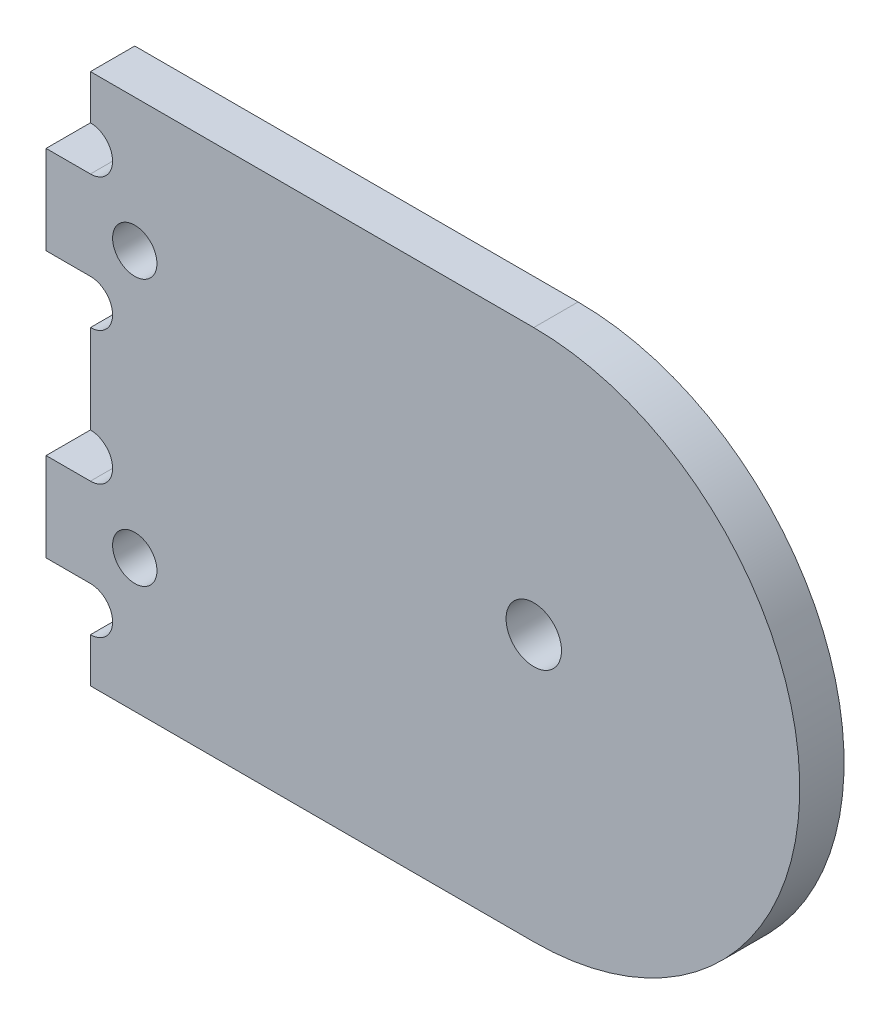
ISO-10303-21;
HEADER;
FILE_DESCRIPTION(('STEP AP214'),'2;1');
FILE_NAME('part.step','',(''),(''),'','','');
FILE_SCHEMA(('AUTOMOTIVE_DESIGN { 1 0 10303 214 1 1 1 1 }'));
ENDSEC;
DATA;
#1=APPLICATION_CONTEXT('core data for automotive mechanical design processes');
#2=APPLICATION_PROTOCOL_DEFINITION('international standard','automotive_design',2000,#1);
#3=PRODUCT_CONTEXT('',#1,'mechanical');
#4=PRODUCT('Part','Part','',(#3));
#5=PRODUCT_RELATED_PRODUCT_CATEGORY('part','',(#4));
#6=PRODUCT_DEFINITION_FORMATION('','',#4);
#7=PRODUCT_DEFINITION_CONTEXT('part definition',#1,'design');
#8=PRODUCT_DEFINITION('design','',#6,#7);
#9=PRODUCT_DEFINITION_SHAPE('','',#8);
#10=(LENGTH_UNIT() NAMED_UNIT(*) SI_UNIT(.MILLI.,.METRE.));
#11=(NAMED_UNIT(*) PLANE_ANGLE_UNIT() SI_UNIT($,.RADIAN.));
#12=(NAMED_UNIT(*) SI_UNIT($,.STERADIAN.) SOLID_ANGLE_UNIT());
#13=UNCERTAINTY_MEASURE_WITH_UNIT(LENGTH_MEASURE(1.E-05),#10,'distance_accuracy_value','');
#14=(GEOMETRIC_REPRESENTATION_CONTEXT(3) GLOBAL_UNCERTAINTY_ASSIGNED_CONTEXT((#13)) GLOBAL_UNIT_ASSIGNED_CONTEXT((#10,
#11,#12)) REPRESENTATION_CONTEXT('',''));
#15=CARTESIAN_POINT('',(0.,0.,0.));
#16=DIRECTION('',(0.,0.,1.));
#17=DIRECTION('',(1.,0.,0.));
#18=AXIS2_PLACEMENT_3D('',#15,#16,#17);
#19=CARTESIAN_POINT('',(-36.0930614932367,10.8790255418588,2.));
#20=DIRECTION('',(0.,0.,1.));
#21=DIRECTION('',(1.,0.,0.));
#22=AXIS2_PLACEMENT_3D('',#19,#20,#21);
#23=PLANE('',#22);
#24=CARTESIAN_POINT('',(-34.0930614932367,7.87902554185879,2.));
#25=DIRECTION('',(0.,0.,1.));
#26=DIRECTION('',(1.,0.,0.));
#27=AXIS2_PLACEMENT_3D('',#24,#25,#26);
#28=CIRCLE('',#27,0.999999999999998);
#29=CARTESIAN_POINT('',(-33.0930614932367,7.87902554185879,2.));
#30=VERTEX_POINT('',#29);
#31=EDGE_CURVE('E338',#30,#30,#28,.T.);
#32=ORIENTED_EDGE('',*,*,#31,.F.);
#33=EDGE_LOOP('',(#32));
#34=FACE_BOUND('',#33,.T.);
#35=DIRECTION('',(0.,-1.,0.));
#36=VECTOR('',#35,1.);
#37=CARTESIAN_POINT('',(-36.0930614932367,13.8790255418588,2.));
#38=LINE('',#37,#36);
#39=CARTESIAN_POINT('',(-36.0930614932367,13.8790255418588,2.));
#40=VERTEX_POINT('',#39);
#41=CARTESIAN_POINT('',(-36.0930614932367,11.8790255418588,2.));
#42=VERTEX_POINT('',#41);
#43=EDGE_CURVE('E209',#40,#42,#38,.T.);
#44=ORIENTED_EDGE('',*,*,#43,.T.);
#45=CARTESIAN_POINT('',(-36.0930614932367,10.8790255418588,2.));
#46=DIRECTION('',(0.,0.,-1.));
#47=DIRECTION('',(1.,0.,0.));
#48=AXIS2_PLACEMENT_3D('',#45,#46,#47);
#49=CIRCLE('',#48,1.);
#50=CARTESIAN_POINT('',(-36.0930614932367,9.87902554185878,2.));
#51=VERTEX_POINT('',#50);
#52=EDGE_CURVE('E117',#42,#51,#49,.T.);
#53=ORIENTED_EDGE('',*,*,#52,.T.);
#54=DIRECTION('',(-1.,0.,0.));
#55=VECTOR('',#54,1.);
#56=CARTESIAN_POINT('',(-36.0930614932367,9.87902554185878,2.));
#57=LINE('',#56,#55);
#58=CARTESIAN_POINT('',(-38.0930614932367,9.87902554185878,2.));
#59=VERTEX_POINT('',#58);
#60=EDGE_CURVE('E248',#51,#59,#57,.T.);
#61=ORIENTED_EDGE('',*,*,#60,.T.);
#62=DIRECTION('',(0.,-1.,0.));
#63=VECTOR('',#62,1.);
#64=CARTESIAN_POINT('',(-38.0930614932367,9.87902554185878,2.));
#65=LINE('',#64,#63);
#66=CARTESIAN_POINT('',(-38.0930614932367,5.87902554185878,2.));
#67=VERTEX_POINT('',#66);
#68=EDGE_CURVE('E267',#59,#67,#65,.T.);
#69=ORIENTED_EDGE('',*,*,#68,.T.);
#70=DIRECTION('',(1.,0.,0.));
#71=VECTOR('',#70,1.);
#72=CARTESIAN_POINT('',(-36.0930614932367,5.87902554185878,2.));
#73=LINE('',#72,#71);
#74=CARTESIAN_POINT('',(-36.0930614932367,5.87902554185878,2.));
#75=VERTEX_POINT('',#74);
#76=EDGE_CURVE('E264',#67,#75,#73,.T.);
#77=ORIENTED_EDGE('',*,*,#76,.T.);
#78=CARTESIAN_POINT('',(-36.0930614932367,4.87902554185878,2.));
#79=DIRECTION('',(0.,0.,-1.));
#80=DIRECTION('',(-1.,0.,0.));
#81=AXIS2_PLACEMENT_3D('',#78,#79,#80);
#82=CIRCLE('',#81,1.);
#83=CARTESIAN_POINT('',(-36.0930614932367,3.87902554185878,2.));
#84=VERTEX_POINT('',#83);
#85=EDGE_CURVE('E266',#75,#84,#82,.T.);
#86=ORIENTED_EDGE('',*,*,#85,.T.);
#87=DIRECTION('',(0.,-1.,0.));
#88=VECTOR('',#87,1.);
#89=CARTESIAN_POINT('',(-36.0930614932367,3.87902554185878,2.));
#90=LINE('',#89,#88);
#91=CARTESIAN_POINT('',(-36.0930614932367,-0.120974458141217,2.));
#92=VERTEX_POINT('',#91);
#93=EDGE_CURVE('E269',#84,#92,#90,.T.);
#94=ORIENTED_EDGE('',*,*,#93,.T.);
#95=CARTESIAN_POINT('',(-36.0930614932367,-1.12097445814122,2.));
#96=DIRECTION('',(0.,0.,-1.));
#97=DIRECTION('',(1.,0.,0.));
#98=AXIS2_PLACEMENT_3D('',#95,#96,#97);
#99=CIRCLE('',#98,1.);
#100=CARTESIAN_POINT('',(-36.0930614932367,-2.12097445814122,2.));
#101=VERTEX_POINT('',#100);
#102=EDGE_CURVE('E275',#92,#101,#99,.T.);
#103=ORIENTED_EDGE('',*,*,#102,.T.);
#104=DIRECTION('',(-1.,0.,0.));
#105=VECTOR('',#104,1.);
#106=CARTESIAN_POINT('',(-36.0930614932367,-2.12097445814122,2.));
#107=LINE('',#106,#105);
#108=CARTESIAN_POINT('',(-38.0930614932367,-2.12097445814122,2.));
#109=VERTEX_POINT('',#108);
#110=EDGE_CURVE('E277',#101,#109,#107,.T.);
#111=ORIENTED_EDGE('',*,*,#110,.T.);
#112=DIRECTION('',(0.,-1.,0.));
#113=VECTOR('',#112,1.);
#114=CARTESIAN_POINT('',(-38.0930614932367,-2.12097445814122,2.));
#115=LINE('',#114,#113);
#116=CARTESIAN_POINT('',(-38.0930614932367,-6.12097445814122,2.));
#117=VERTEX_POINT('',#116);
#118=EDGE_CURVE('E279',#109,#117,#115,.T.);
#119=ORIENTED_EDGE('',*,*,#118,.T.);
#120=DIRECTION('',(1.,0.,0.));
#121=VECTOR('',#120,1.);
#122=CARTESIAN_POINT('',(-36.0930614932367,-6.12097445814122,2.));
#123=LINE('',#122,#121);
#124=CARTESIAN_POINT('',(-36.0930614932367,-6.12097445814122,2.));
#125=VERTEX_POINT('',#124);
#126=EDGE_CURVE('E281',#117,#125,#123,.T.);
#127=ORIENTED_EDGE('',*,*,#126,.T.);
#128=CARTESIAN_POINT('',(-36.0930614932367,-7.12097445814122,2.));
#129=DIRECTION('',(0.,0.,-1.));
#130=DIRECTION('',(-1.,0.,0.));
#131=AXIS2_PLACEMENT_3D('',#128,#129,#130);
#132=CIRCLE('',#131,1.);
#133=CARTESIAN_POINT('',(-36.0930614932367,-8.12097445814122,2.));
#134=VERTEX_POINT('',#133);
#135=EDGE_CURVE('E283',#125,#134,#132,.T.);
#136=ORIENTED_EDGE('',*,*,#135,.T.);
#137=DIRECTION('',(0.,-1.,0.));
#138=VECTOR('',#137,1.);
#139=CARTESIAN_POINT('',(-36.0930614932367,-8.12097445814122,2.));
#140=LINE('',#139,#138);
#141=CARTESIAN_POINT('',(-36.0930614932367,-10.1209744581412,2.));
#142=VERTEX_POINT('',#141);
#143=EDGE_CURVE('E160',#134,#142,#140,.T.);
#144=ORIENTED_EDGE('',*,*,#143,.T.);
#145=DIRECTION('',(1.,0.,0.));
#146=VECTOR('',#145,1.);
#147=CARTESIAN_POINT('',(-36.0930614932367,-10.1209744581412,2.));
#148=LINE('',#147,#146);
#149=CARTESIAN_POINT('',(-16.0930614932367,-10.1209744581412,2.));
#150=VERTEX_POINT('',#149);
#151=EDGE_CURVE('E154',#142,#150,#148,.T.);
#152=ORIENTED_EDGE('',*,*,#151,.T.);
#153=CARTESIAN_POINT('',(-16.0930614932367,1.87902554185879,2.));
#154=DIRECTION('',(0.,0.,1.));
#155=DIRECTION('',(1.,0.,0.));
#156=AXIS2_PLACEMENT_3D('',#153,#154,#155);
#157=CIRCLE('',#156,12.);
#158=CARTESIAN_POINT('',(-16.0930614932367,13.8790255418588,2.));
#159=VERTEX_POINT('',#158);
#160=EDGE_CURVE('E158',#150,#159,#157,.T.);
#161=ORIENTED_EDGE('',*,*,#160,.T.);
#162=DIRECTION('',(-1.,0.,0.));
#163=VECTOR('',#162,1.);
#164=CARTESIAN_POINT('',(-36.0930614932367,13.8790255418588,2.));
#165=LINE('',#164,#163);
#166=EDGE_CURVE('E50',#159,#40,#165,.T.);
#167=ORIENTED_EDGE('',*,*,#166,.T.);
#168=EDGE_LOOP('',(#44,#53,#61,#69,#77,#86,#94,#103,#111,#119,#127,#136,#144,#152,#161,#167));
#169=FACE_BOUND('',#168,.T.);
#170=CARTESIAN_POINT('',(-16.0930614932367,1.87902554185879,2.));
#171=DIRECTION('',(0.,0.,1.));
#172=DIRECTION('',(1.,0.,0.));
#173=AXIS2_PLACEMENT_3D('',#170,#171,#172);
#174=CIRCLE('',#173,1.25);
#175=CARTESIAN_POINT('',(-14.8430614932367,1.87902554185879,2.));
#176=VERTEX_POINT('',#175);
#177=EDGE_CURVE('E182',#176,#176,#174,.T.);
#178=ORIENTED_EDGE('',*,*,#177,.F.);
#179=EDGE_LOOP('',(#178));
#180=FACE_BOUND('',#179,.T.);
#181=CARTESIAN_POINT('',(-34.0930614932367,-4.12097445814122,2.));
#182=DIRECTION('',(0.,0.,1.));
#183=DIRECTION('',(1.,0.,0.));
#184=AXIS2_PLACEMENT_3D('',#181,#182,#183);
#185=CIRCLE('',#184,0.999999999999998);
#186=CARTESIAN_POINT('',(-33.0930614932367,-4.12097445814122,2.));
#187=VERTEX_POINT('',#186);
#188=EDGE_CURVE('E329',#187,#187,#185,.T.);
#189=ORIENTED_EDGE('',*,*,#188,.F.);
#190=EDGE_LOOP('',(#189));
#191=FACE_BOUND('',#190,.T.);
#192=ADVANCED_FACE('F33',(#34,#169,#180,#191),#23,.T.);
#193=CARTESIAN_POINT('',(-36.0930614932367,10.8790255418588,0.));
#194=DIRECTION('',(0.,0.,1.));
#195=DIRECTION('',(1.,0.,0.));
#196=AXIS2_PLACEMENT_3D('',#193,#194,#195);
#197=PLANE('',#196);
#198=DIRECTION('',(0.,-1.,0.));
#199=VECTOR('',#198,1.);
#200=CARTESIAN_POINT('',(-36.0930614932367,13.8790255418588,0.));
#201=LINE('',#200,#199);
#202=CARTESIAN_POINT('',(-36.0930614932367,13.8790255418588,0.));
#203=VERTEX_POINT('',#202);
#204=CARTESIAN_POINT('',(-36.0930614932367,11.8790255418588,0.));
#205=VERTEX_POINT('',#204);
#206=EDGE_CURVE('E178',#203,#205,#201,.T.);
#207=ORIENTED_EDGE('',*,*,#206,.F.);
#208=DIRECTION('',(-1.,0.,0.));
#209=VECTOR('',#208,1.);
#210=CARTESIAN_POINT('',(-36.0930614932367,13.8790255418588,0.));
#211=LINE('',#210,#209);
#212=CARTESIAN_POINT('',(-16.0930614932367,13.8790255418588,0.));
#213=VERTEX_POINT('',#212);
#214=EDGE_CURVE('E109',#213,#203,#211,.T.);
#215=ORIENTED_EDGE('',*,*,#214,.F.);
#216=CARTESIAN_POINT('',(-16.0930614932367,1.87902554185879,0.));
#217=DIRECTION('',(0.,0.,1.));
#218=DIRECTION('',(1.,0.,0.));
#219=AXIS2_PLACEMENT_3D('',#216,#217,#218);
#220=CIRCLE('',#219,12.);
#221=CARTESIAN_POINT('',(-16.0930614932367,-10.1209744581412,0.));
#222=VERTEX_POINT('',#221);
#223=EDGE_CURVE('E103',#222,#213,#220,.T.);
#224=ORIENTED_EDGE('',*,*,#223,.F.);
#225=DIRECTION('',(1.,0.,0.));
#226=VECTOR('',#225,1.);
#227=CARTESIAN_POINT('',(-36.0930614932367,-10.1209744581412,0.));
#228=LINE('',#227,#226);
#229=CARTESIAN_POINT('',(-36.0930614932367,-10.1209744581412,0.));
#230=VERTEX_POINT('',#229);
#231=EDGE_CURVE('E168',#230,#222,#228,.T.);
#232=ORIENTED_EDGE('',*,*,#231,.F.);
#233=DIRECTION('',(0.,-1.,0.));
#234=VECTOR('',#233,1.);
#235=CARTESIAN_POINT('',(-36.0930614932367,-8.12097445814122,0.));
#236=LINE('',#235,#234);
#237=CARTESIAN_POINT('',(-36.0930614932367,-8.12097445814122,0.));
#238=VERTEX_POINT('',#237);
#239=EDGE_CURVE('E204',#238,#230,#236,.T.);
#240=ORIENTED_EDGE('',*,*,#239,.F.);
#241=CARTESIAN_POINT('',(-36.0930614932367,-7.12097445814122,0.));
#242=DIRECTION('',(0.,0.,-1.));
#243=DIRECTION('',(-1.,0.,0.));
#244=AXIS2_PLACEMENT_3D('',#241,#242,#243);
#245=CIRCLE('',#244,1.);
#246=CARTESIAN_POINT('',(-36.0930614932367,-6.12097445814122,0.));
#247=VERTEX_POINT('',#246);
#248=EDGE_CURVE('E202',#247,#238,#245,.T.);
#249=ORIENTED_EDGE('',*,*,#248,.F.);
#250=DIRECTION('',(1.,0.,0.));
#251=VECTOR('',#250,1.);
#252=CARTESIAN_POINT('',(-36.0930614932367,-6.12097445814122,0.));
#253=LINE('',#252,#251);
#254=CARTESIAN_POINT('',(-38.0930614932367,-6.12097445814122,0.));
#255=VERTEX_POINT('',#254);
#256=EDGE_CURVE('E200',#255,#247,#253,.T.);
#257=ORIENTED_EDGE('',*,*,#256,.F.);
#258=DIRECTION('',(0.,-1.,0.));
#259=VECTOR('',#258,1.);
#260=CARTESIAN_POINT('',(-38.0930614932367,-2.12097445814122,0.));
#261=LINE('',#260,#259);
#262=CARTESIAN_POINT('',(-38.0930614932367,-2.12097445814122,0.));
#263=VERTEX_POINT('',#262);
#264=EDGE_CURVE('E198',#263,#255,#261,.T.);
#265=ORIENTED_EDGE('',*,*,#264,.F.);
#266=DIRECTION('',(-1.,0.,0.));
#267=VECTOR('',#266,1.);
#268=CARTESIAN_POINT('',(-36.0930614932367,-2.12097445814122,0.));
#269=LINE('',#268,#267);
#270=CARTESIAN_POINT('',(-36.0930614932367,-2.12097445814122,0.));
#271=VERTEX_POINT('',#270);
#272=EDGE_CURVE('E196',#271,#263,#269,.T.);
#273=ORIENTED_EDGE('',*,*,#272,.F.);
#274=CARTESIAN_POINT('',(-36.0930614932367,-1.12097445814122,0.));
#275=DIRECTION('',(0.,0.,-1.));
#276=DIRECTION('',(1.,0.,0.));
#277=AXIS2_PLACEMENT_3D('',#274,#275,#276);
#278=CIRCLE('',#277,1.);
#279=CARTESIAN_POINT('',(-36.0930614932367,-0.120974458141217,0.));
#280=VERTEX_POINT('',#279);
#281=EDGE_CURVE('E194',#280,#271,#278,.T.);
#282=ORIENTED_EDGE('',*,*,#281,.F.);
#283=DIRECTION('',(0.,-1.,0.));
#284=VECTOR('',#283,1.);
#285=CARTESIAN_POINT('',(-36.0930614932367,3.87902554185878,0.));
#286=LINE('',#285,#284);
#287=CARTESIAN_POINT('',(-36.0930614932367,3.87902554185878,0.));
#288=VERTEX_POINT('',#287);
#289=EDGE_CURVE('E192',#288,#280,#286,.T.);
#290=ORIENTED_EDGE('',*,*,#289,.F.);
#291=CARTESIAN_POINT('',(-36.0930614932367,4.87902554185878,0.));
#292=DIRECTION('',(0.,0.,-1.));
#293=DIRECTION('',(-1.,0.,0.));
#294=AXIS2_PLACEMENT_3D('',#291,#292,#293);
#295=CIRCLE('',#294,1.);
#296=CARTESIAN_POINT('',(-36.0930614932367,5.87902554185878,0.));
#297=VERTEX_POINT('',#296);
#298=EDGE_CURVE('E190',#297,#288,#295,.T.);
#299=ORIENTED_EDGE('',*,*,#298,.F.);
#300=DIRECTION('',(1.,0.,0.));
#301=VECTOR('',#300,1.);
#302=CARTESIAN_POINT('',(-36.0930614932367,5.87902554185878,0.));
#303=LINE('',#302,#301);
#304=CARTESIAN_POINT('',(-38.0930614932367,5.87902554185878,0.));
#305=VERTEX_POINT('',#304);
#306=EDGE_CURVE('E188',#305,#297,#303,.T.);
#307=ORIENTED_EDGE('',*,*,#306,.F.);
#308=DIRECTION('',(0.,-1.,0.));
#309=VECTOR('',#308,1.);
#310=CARTESIAN_POINT('',(-38.0930614932367,9.87902554185878,0.));
#311=LINE('',#310,#309);
#312=CARTESIAN_POINT('',(-38.0930614932367,9.87902554185878,0.));
#313=VERTEX_POINT('',#312);
#314=EDGE_CURVE('E186',#313,#305,#311,.T.);
#315=ORIENTED_EDGE('',*,*,#314,.F.);
#316=DIRECTION('',(-1.,0.,0.));
#317=VECTOR('',#316,1.);
#318=CARTESIAN_POINT('',(-36.0930614932367,9.87902554185878,0.));
#319=LINE('',#318,#317);
#320=CARTESIAN_POINT('',(-36.0930614932367,9.87902554185878,0.));
#321=VERTEX_POINT('',#320);
#322=EDGE_CURVE('E184',#321,#313,#319,.T.);
#323=ORIENTED_EDGE('',*,*,#322,.F.);
#324=CARTESIAN_POINT('',(-36.0930614932367,10.8790255418588,0.));
#325=DIRECTION('',(0.,0.,-1.));
#326=DIRECTION('',(1.,0.,0.));
#327=AXIS2_PLACEMENT_3D('',#324,#325,#326);
#328=CIRCLE('',#327,1.);
#329=EDGE_CURVE('E181',#205,#321,#328,.T.);
#330=ORIENTED_EDGE('',*,*,#329,.F.);
#331=EDGE_LOOP('',(#207,#215,#224,#232,#240,#249,#257,#265,#273,#282,#290,#299,#307,#315,#323,#330));
#332=FACE_BOUND('',#331,.T.);
#333=CARTESIAN_POINT('',(-16.0930614932367,1.87902554185879,0.));
#334=DIRECTION('',(0.,0.,1.));
#335=DIRECTION('',(1.,0.,0.));
#336=AXIS2_PLACEMENT_3D('',#333,#334,#335);
#337=CIRCLE('',#336,1.25);
#338=CARTESIAN_POINT('',(-14.8430614932367,1.87902554185879,0.));
#339=VERTEX_POINT('',#338);
#340=EDGE_CURVE('E341',#339,#339,#337,.T.);
#341=ORIENTED_EDGE('',*,*,#340,.T.);
#342=EDGE_LOOP('',(#341));
#343=FACE_BOUND('',#342,.T.);
#344=CARTESIAN_POINT('',(-34.0930614932367,7.87902554185879,0.));
#345=DIRECTION('',(0.,0.,1.));
#346=DIRECTION('',(1.,0.,0.));
#347=AXIS2_PLACEMENT_3D('',#344,#345,#346);
#348=CIRCLE('',#347,0.999999999999998);
#349=CARTESIAN_POINT('',(-33.0930614932367,7.87902554185879,0.));
#350=VERTEX_POINT('',#349);
#351=EDGE_CURVE('E335',#350,#350,#348,.T.);
#352=ORIENTED_EDGE('',*,*,#351,.T.);
#353=EDGE_LOOP('',(#352));
#354=FACE_BOUND('',#353,.T.);
#355=CARTESIAN_POINT('',(-34.0930614932367,-4.12097445814122,0.));
#356=DIRECTION('',(0.,0.,1.));
#357=DIRECTION('',(1.,0.,0.));
#358=AXIS2_PLACEMENT_3D('',#355,#356,#357);
#359=CIRCLE('',#358,0.999999999999998);
#360=CARTESIAN_POINT('',(-33.0930614932367,-4.12097445814122,0.));
#361=VERTEX_POINT('',#360);
#362=EDGE_CURVE('E332',#361,#361,#359,.T.);
#363=ORIENTED_EDGE('',*,*,#362,.T.);
#364=EDGE_LOOP('',(#363));
#365=FACE_BOUND('',#364,.T.);
#366=ADVANCED_FACE('F252',(#332,#343,#354,#365),#197,.F.);
#367=CARTESIAN_POINT('',(-36.0930614932367,13.8790255418588,2.));
#368=DIRECTION('',(1.,0.,0.));
#369=DIRECTION('',(0.,0.,-1.));
#370=AXIS2_PLACEMENT_3D('',#367,#368,#369);
#371=PLANE('',#370);
#372=ORIENTED_EDGE('',*,*,#206,.T.);
#373=DIRECTION('',(0.,0.,-1.));
#374=VECTOR('',#373,1.);
#375=CARTESIAN_POINT('',(-36.0930614932367,11.8790255418588,2.));
#376=LINE('',#375,#374);
#377=EDGE_CURVE('E11',#42,#205,#376,.T.);
#378=ORIENTED_EDGE('',*,*,#377,.F.);
#379=ORIENTED_EDGE('',*,*,#43,.F.);
#380=DIRECTION('',(0.,0.,-1.));
#381=VECTOR('',#380,1.);
#382=CARTESIAN_POINT('',(-36.0930614932367,13.8790255418588,2.));
#383=LINE('',#382,#381);
#384=EDGE_CURVE('E174',#40,#203,#383,.T.);
#385=ORIENTED_EDGE('',*,*,#384,.T.);
#386=EDGE_LOOP('',(#372,#378,#379,#385));
#387=FACE_BOUND('',#386,.T.);
#388=ADVANCED_FACE('F35',(#387),#371,.F.);
#389=CARTESIAN_POINT('',(-36.0930614932367,10.8790255418588,2.));
#390=DIRECTION('',(0.,0.,-1.));
#391=DIRECTION('',(-1.,0.,0.));
#392=AXIS2_PLACEMENT_3D('',#389,#390,#391);
#393=CYLINDRICAL_SURFACE('',#392,1.);
#394=ORIENTED_EDGE('',*,*,#329,.T.);
#395=DIRECTION('',(0.,0.,-1.));
#396=VECTOR('',#395,1.);
#397=CARTESIAN_POINT('',(-36.0930614932367,9.87902554185878,2.));
#398=LINE('',#397,#396);
#399=EDGE_CURVE('E42',#51,#321,#398,.T.);
#400=ORIENTED_EDGE('',*,*,#399,.F.);
#401=ORIENTED_EDGE('',*,*,#52,.F.);
#402=ORIENTED_EDGE('',*,*,#377,.T.);
#403=EDGE_LOOP('',(#394,#400,#401,#402));
#404=FACE_BOUND('',#403,.T.);
#405=ADVANCED_FACE('F483',(#404),#393,.F.);
#406=CARTESIAN_POINT('',(-36.0930614932367,9.87902554185878,2.));
#407=DIRECTION('',(0.,-1.,0.));
#408=DIRECTION('',(0.,0.,-1.));
#409=AXIS2_PLACEMENT_3D('',#406,#407,#408);
#410=PLANE('',#409);
#411=ORIENTED_EDGE('',*,*,#322,.T.);
#412=DIRECTION('',(0.,0.,-1.));
#413=VECTOR('',#412,1.);
#414=CARTESIAN_POINT('',(-38.0930614932367,9.87902554185878,2.));
#415=LINE('',#414,#413);
#416=EDGE_CURVE('E240',#59,#313,#415,.T.);
#417=ORIENTED_EDGE('',*,*,#416,.F.);
#418=ORIENTED_EDGE('',*,*,#60,.F.);
#419=ORIENTED_EDGE('',*,*,#399,.T.);
#420=EDGE_LOOP('',(#411,#417,#418,#419));
#421=FACE_BOUND('',#420,.T.);
#422=ADVANCED_FACE('F246',(#421),#410,.F.);
#423=CARTESIAN_POINT('',(-38.0930614932367,9.87902554185878,2.));
#424=DIRECTION('',(1.,0.,0.));
#425=DIRECTION('',(0.,0.,-1.));
#426=AXIS2_PLACEMENT_3D('',#423,#424,#425);
#427=PLANE('',#426);
#428=ORIENTED_EDGE('',*,*,#314,.T.);
#429=DIRECTION('',(0.,0.,-1.));
#430=VECTOR('',#429,1.);
#431=CARTESIAN_POINT('',(-38.0930614932367,5.87902554185878,2.));
#432=LINE('',#431,#430);
#433=EDGE_CURVE('E237',#67,#305,#432,.T.);
#434=ORIENTED_EDGE('',*,*,#433,.F.);
#435=ORIENTED_EDGE('',*,*,#68,.F.);
#436=ORIENTED_EDGE('',*,*,#416,.T.);
#437=EDGE_LOOP('',(#428,#434,#435,#436));
#438=FACE_BOUND('',#437,.T.);
#439=ADVANCED_FACE('F258',(#438),#427,.F.);
#440=CARTESIAN_POINT('',(-36.0930614932367,5.87902554185878,2.));
#441=DIRECTION('',(0.,1.,0.));
#442=DIRECTION('',(0.,0.,1.));
#443=AXIS2_PLACEMENT_3D('',#440,#441,#442);
#444=PLANE('',#443);
#445=ORIENTED_EDGE('',*,*,#306,.T.);
#446=DIRECTION('',(0.,0.,-1.));
#447=VECTOR('',#446,1.);
#448=CARTESIAN_POINT('',(-36.0930614932367,5.87902554185878,2.));
#449=LINE('',#448,#447);
#450=EDGE_CURVE('E234',#75,#297,#449,.T.);
#451=ORIENTED_EDGE('',*,*,#450,.F.);
#452=ORIENTED_EDGE('',*,*,#76,.F.);
#453=ORIENTED_EDGE('',*,*,#433,.T.);
#454=EDGE_LOOP('',(#445,#451,#452,#453));
#455=FACE_BOUND('',#454,.T.);
#456=ADVANCED_FACE('F262',(#455),#444,.F.);
#457=CARTESIAN_POINT('',(-36.0930614932367,4.87902554185878,2.));
#458=DIRECTION('',(0.,0.,-1.));
#459=DIRECTION('',(-1.,0.,0.));
#460=AXIS2_PLACEMENT_3D('',#457,#458,#459);
#461=CYLINDRICAL_SURFACE('',#460,1.);
#462=ORIENTED_EDGE('',*,*,#298,.T.);
#463=DIRECTION('',(0.,0.,-1.));
#464=VECTOR('',#463,1.);
#465=CARTESIAN_POINT('',(-36.0930614932367,3.87902554185878,2.));
#466=LINE('',#465,#464);
#467=EDGE_CURVE('E231',#84,#288,#466,.T.);
#468=ORIENTED_EDGE('',*,*,#467,.F.);
#469=ORIENTED_EDGE('',*,*,#85,.F.);
#470=ORIENTED_EDGE('',*,*,#450,.T.);
#471=EDGE_LOOP('',(#462,#468,#469,#470));
#472=FACE_BOUND('',#471,.T.);
#473=ADVANCED_FACE('F448',(#472),#461,.F.);
#474=CARTESIAN_POINT('',(-36.0930614932367,3.87902554185878,2.));
#475=DIRECTION('',(1.,0.,0.));
#476=DIRECTION('',(0.,0.,-1.));
#477=AXIS2_PLACEMENT_3D('',#474,#475,#476);
#478=PLANE('',#477);
#479=ORIENTED_EDGE('',*,*,#289,.T.);
#480=DIRECTION('',(0.,0.,-1.));
#481=VECTOR('',#480,1.);
#482=CARTESIAN_POINT('',(-36.0930614932367,-0.120974458141217,2.));
#483=LINE('',#482,#481);
#484=EDGE_CURVE('E228',#92,#280,#483,.T.);
#485=ORIENTED_EDGE('',*,*,#484,.F.);
#486=ORIENTED_EDGE('',*,*,#93,.F.);
#487=ORIENTED_EDGE('',*,*,#467,.T.);
#488=EDGE_LOOP('',(#479,#485,#486,#487));
#489=FACE_BOUND('',#488,.T.);
#490=ADVANCED_FACE('F438',(#489),#478,.F.);
#491=CARTESIAN_POINT('',(-36.0930614932367,-1.12097445814122,2.));
#492=DIRECTION('',(0.,0.,-1.));
#493=DIRECTION('',(-1.,0.,0.));
#494=AXIS2_PLACEMENT_3D('',#491,#492,#493);
#495=CYLINDRICAL_SURFACE('',#494,1.);
#496=ORIENTED_EDGE('',*,*,#281,.T.);
#497=DIRECTION('',(0.,0.,-1.));
#498=VECTOR('',#497,1.);
#499=CARTESIAN_POINT('',(-36.0930614932367,-2.12097445814122,2.));
#500=LINE('',#499,#498);
#501=EDGE_CURVE('E225',#101,#271,#500,.T.);
#502=ORIENTED_EDGE('',*,*,#501,.F.);
#503=ORIENTED_EDGE('',*,*,#102,.F.);
#504=ORIENTED_EDGE('',*,*,#484,.T.);
#505=EDGE_LOOP('',(#496,#502,#503,#504));
#506=FACE_BOUND('',#505,.T.);
#507=ADVANCED_FACE('F428',(#506),#495,.F.);
#508=CARTESIAN_POINT('',(-36.0930614932367,-2.12097445814122,2.));
#509=DIRECTION('',(0.,-1.,0.));
#510=DIRECTION('',(0.,0.,-1.));
#511=AXIS2_PLACEMENT_3D('',#508,#509,#510);
#512=PLANE('',#511);
#513=ORIENTED_EDGE('',*,*,#272,.T.);
#514=DIRECTION('',(0.,0.,-1.));
#515=VECTOR('',#514,1.);
#516=CARTESIAN_POINT('',(-38.0930614932367,-2.12097445814122,2.));
#517=LINE('',#516,#515);
#518=EDGE_CURVE('E222',#109,#263,#517,.T.);
#519=ORIENTED_EDGE('',*,*,#518,.F.);
#520=ORIENTED_EDGE('',*,*,#110,.F.);
#521=ORIENTED_EDGE('',*,*,#501,.T.);
#522=EDGE_LOOP('',(#513,#519,#520,#521));
#523=FACE_BOUND('',#522,.T.);
#524=ADVANCED_FACE('F418',(#523),#512,.F.);
#525=CARTESIAN_POINT('',(-38.0930614932367,-2.12097445814122,2.));
#526=DIRECTION('',(1.,0.,0.));
#527=DIRECTION('',(0.,0.,-1.));
#528=AXIS2_PLACEMENT_3D('',#525,#526,#527);
#529=PLANE('',#528);
#530=ORIENTED_EDGE('',*,*,#264,.T.);
#531=DIRECTION('',(0.,0.,-1.));
#532=VECTOR('',#531,1.);
#533=CARTESIAN_POINT('',(-38.0930614932367,-6.12097445814122,2.));
#534=LINE('',#533,#532);
#535=EDGE_CURVE('E219',#117,#255,#534,.T.);
#536=ORIENTED_EDGE('',*,*,#535,.F.);
#537=ORIENTED_EDGE('',*,*,#118,.F.);
#538=ORIENTED_EDGE('',*,*,#518,.T.);
#539=EDGE_LOOP('',(#530,#536,#537,#538));
#540=FACE_BOUND('',#539,.T.);
#541=ADVANCED_FACE('F408',(#540),#529,.F.);
#542=CARTESIAN_POINT('',(-36.0930614932367,-6.12097445814122,2.));
#543=DIRECTION('',(0.,1.,0.));
#544=DIRECTION('',(0.,0.,1.));
#545=AXIS2_PLACEMENT_3D('',#542,#543,#544);
#546=PLANE('',#545);
#547=ORIENTED_EDGE('',*,*,#256,.T.);
#548=DIRECTION('',(0.,0.,-1.));
#549=VECTOR('',#548,1.);
#550=CARTESIAN_POINT('',(-36.0930614932367,-6.12097445814122,2.));
#551=LINE('',#550,#549);
#552=EDGE_CURVE('E216',#125,#247,#551,.T.);
#553=ORIENTED_EDGE('',*,*,#552,.F.);
#554=ORIENTED_EDGE('',*,*,#126,.F.);
#555=ORIENTED_EDGE('',*,*,#535,.T.);
#556=EDGE_LOOP('',(#547,#553,#554,#555));
#557=FACE_BOUND('',#556,.T.);
#558=ADVANCED_FACE('F399',(#557),#546,.F.);
#559=CARTESIAN_POINT('',(-36.0930614932367,-7.12097445814122,2.));
#560=DIRECTION('',(0.,0.,-1.));
#561=DIRECTION('',(-1.,0.,0.));
#562=AXIS2_PLACEMENT_3D('',#559,#560,#561);
#563=CYLINDRICAL_SURFACE('',#562,1.);
#564=ORIENTED_EDGE('',*,*,#248,.T.);
#565=DIRECTION('',(0.,0.,-1.));
#566=VECTOR('',#565,1.);
#567=CARTESIAN_POINT('',(-36.0930614932367,-8.12097445814122,2.));
#568=LINE('',#567,#566);
#569=EDGE_CURVE('E213',#134,#238,#568,.T.);
#570=ORIENTED_EDGE('',*,*,#569,.F.);
#571=ORIENTED_EDGE('',*,*,#135,.F.);
#572=ORIENTED_EDGE('',*,*,#552,.T.);
#573=EDGE_LOOP('',(#564,#570,#571,#572));
#574=FACE_BOUND('',#573,.T.);
#575=ADVANCED_FACE('F289',(#574),#563,.F.);
#576=CARTESIAN_POINT('',(-36.0930614932367,-8.12097445814122,2.));
#577=DIRECTION('',(1.,0.,0.));
#578=DIRECTION('',(0.,0.,-1.));
#579=AXIS2_PLACEMENT_3D('',#576,#577,#578);
#580=PLANE('',#579);
#581=ORIENTED_EDGE('',*,*,#239,.T.);
#582=DIRECTION('',(0.,0.,-1.));
#583=VECTOR('',#582,1.);
#584=CARTESIAN_POINT('',(-36.0930614932367,-10.1209744581412,2.));
#585=LINE('',#584,#583);
#586=EDGE_CURVE('E169',#142,#230,#585,.T.);
#587=ORIENTED_EDGE('',*,*,#586,.F.);
#588=ORIENTED_EDGE('',*,*,#143,.F.);
#589=ORIENTED_EDGE('',*,*,#569,.T.);
#590=EDGE_LOOP('',(#581,#587,#588,#589));
#591=FACE_BOUND('',#590,.T.);
#592=ADVANCED_FACE('F293',(#591),#580,.F.);
#593=CARTESIAN_POINT('',(-36.0930614932367,-10.1209744581412,2.));
#594=DIRECTION('',(0.,1.,0.));
#595=DIRECTION('',(0.,0.,1.));
#596=AXIS2_PLACEMENT_3D('',#593,#594,#595);
#597=PLANE('',#596);
#598=ORIENTED_EDGE('',*,*,#231,.T.);
#599=DIRECTION('',(0.,0.,-1.));
#600=VECTOR('',#599,1.);
#601=CARTESIAN_POINT('',(-16.0930614932367,-10.1209744581412,2.));
#602=LINE('',#601,#600);
#603=EDGE_CURVE('E165',#150,#222,#602,.T.);
#604=ORIENTED_EDGE('',*,*,#603,.F.);
#605=ORIENTED_EDGE('',*,*,#151,.F.);
#606=ORIENTED_EDGE('',*,*,#586,.T.);
#607=EDGE_LOOP('',(#598,#604,#605,#606));
#608=FACE_BOUND('',#607,.T.);
#609=ADVANCED_FACE('F166',(#608),#597,.F.);
#610=CARTESIAN_POINT('',(-16.0930614932367,1.87902554185879,2.));
#611=DIRECTION('',(0.,0.,-1.));
#612=DIRECTION('',(-1.,0.,0.));
#613=AXIS2_PLACEMENT_3D('',#610,#611,#612);
#614=CYLINDRICAL_SURFACE('',#613,12.);
#615=ORIENTED_EDGE('',*,*,#223,.T.);
#616=DIRECTION('',(0.,0.,-1.));
#617=VECTOR('',#616,1.);
#618=CARTESIAN_POINT('',(-16.0930614932367,13.8790255418588,2.));
#619=LINE('',#618,#617);
#620=EDGE_CURVE('E170',#159,#213,#619,.T.);
#621=ORIENTED_EDGE('',*,*,#620,.F.);
#622=ORIENTED_EDGE('',*,*,#160,.F.);
#623=ORIENTED_EDGE('',*,*,#603,.T.);
#624=EDGE_LOOP('',(#615,#621,#622,#623));
#625=FACE_BOUND('',#624,.T.);
#626=ADVANCED_FACE('F172',(#625),#614,.T.);
#627=CARTESIAN_POINT('',(-36.0930614932367,13.8790255418588,2.));
#628=DIRECTION('',(0.,-1.,0.));
#629=DIRECTION('',(0.,0.,-1.));
#630=AXIS2_PLACEMENT_3D('',#627,#628,#629);
#631=PLANE('',#630);
#632=ORIENTED_EDGE('',*,*,#214,.T.);
#633=ORIENTED_EDGE('',*,*,#384,.F.);
#634=ORIENTED_EDGE('',*,*,#166,.F.);
#635=ORIENTED_EDGE('',*,*,#620,.T.);
#636=EDGE_LOOP('',(#632,#633,#634,#635));
#637=FACE_BOUND('',#636,.T.);
#638=ADVANCED_FACE('F297',(#637),#631,.F.);
#639=CARTESIAN_POINT('',(-16.0930614932367,1.87902554185879,2.));
#640=DIRECTION('',(0.,0.,-1.));
#641=DIRECTION('',(-1.,0.,0.));
#642=AXIS2_PLACEMENT_3D('',#639,#640,#641);
#643=CYLINDRICAL_SURFACE('',#642,1.25);
#644=ORIENTED_EDGE('',*,*,#177,.T.);
#645=EDGE_LOOP('',(#644));
#646=FACE_BOUND('',#645,.T.);
#647=ORIENTED_EDGE('',*,*,#340,.F.);
#648=EDGE_LOOP('',(#647));
#649=FACE_BOUND('',#648,.T.);
#650=ADVANCED_FACE('F299',(#646,#649),#643,.F.);
#651=CARTESIAN_POINT('',(-34.0930614932367,7.87902554185879,2.));
#652=DIRECTION('',(0.,0.,-1.));
#653=DIRECTION('',(-1.,0.,0.));
#654=AXIS2_PLACEMENT_3D('',#651,#652,#653);
#655=CYLINDRICAL_SURFACE('',#654,0.999999999999998);
#656=ORIENTED_EDGE('',*,*,#31,.T.);
#657=EDGE_LOOP('',(#656));
#658=FACE_BOUND('',#657,.T.);
#659=ORIENTED_EDGE('',*,*,#351,.F.);
#660=EDGE_LOOP('',(#659));
#661=FACE_BOUND('',#660,.T.);
#662=ADVANCED_FACE('F305',(#658,#661),#655,.F.);
#663=CARTESIAN_POINT('',(-34.0930614932367,-4.12097445814122,2.));
#664=DIRECTION('',(0.,0.,-1.));
#665=DIRECTION('',(-1.,0.,0.));
#666=AXIS2_PLACEMENT_3D('',#663,#664,#665);
#667=CYLINDRICAL_SURFACE('',#666,0.999999999999998);
#668=ORIENTED_EDGE('',*,*,#188,.T.);
#669=EDGE_LOOP('',(#668));
#670=FACE_BOUND('',#669,.T.);
#671=ORIENTED_EDGE('',*,*,#362,.F.);
#672=EDGE_LOOP('',(#671));
#673=FACE_BOUND('',#672,.T.);
#674=ADVANCED_FACE('F320',(#670,#673),#667,.F.);
#675=CLOSED_SHELL('',(#192,#366,#388,#405,#422,#439,#456,#473,#490,#507,#524,#541,#558,#575,
#592,#609,#626,#638,#650,#662,#674));
#676=MANIFOLD_SOLID_BREP('B2',#675);
#677=ADVANCED_BREP_SHAPE_REPRESENTATION('',(#18,#676),#14);
#678=SHAPE_DEFINITION_REPRESENTATION(#9,#677);
ENDSEC;
END-ISO-10303-21;
